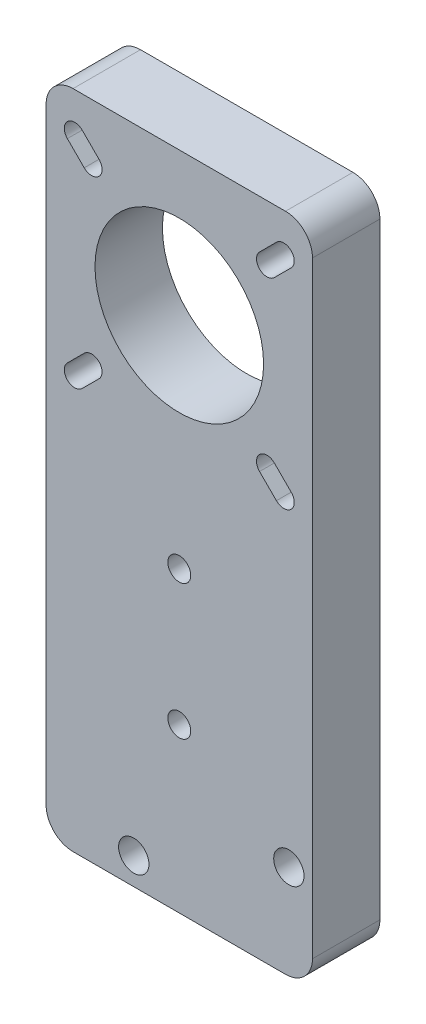
ISO-10303-21;
HEADER;
FILE_DESCRIPTION(('STEP AP214'),'2;1');
FILE_NAME('part.step','',(''),(''),'','','');
FILE_SCHEMA(('AUTOMOTIVE_DESIGN { 1 0 10303 214 1 1 1 1 }'));
ENDSEC;
DATA;
#1=APPLICATION_CONTEXT('core data for automotive mechanical design processes');
#2=APPLICATION_PROTOCOL_DEFINITION('international standard','automotive_design',2000,#1);
#3=PRODUCT_CONTEXT('',#1,'mechanical');
#4=PRODUCT('Part','Part','',(#3));
#5=PRODUCT_RELATED_PRODUCT_CATEGORY('part','',(#4));
#6=PRODUCT_DEFINITION_FORMATION('','',#4);
#7=PRODUCT_DEFINITION_CONTEXT('part definition',#1,'design');
#8=PRODUCT_DEFINITION('design','',#6,#7);
#9=PRODUCT_DEFINITION_SHAPE('','',#8);
#10=(LENGTH_UNIT() NAMED_UNIT(*) SI_UNIT(.MILLI.,.METRE.));
#11=(NAMED_UNIT(*) PLANE_ANGLE_UNIT() SI_UNIT($,.RADIAN.));
#12=(NAMED_UNIT(*) SI_UNIT($,.STERADIAN.) SOLID_ANGLE_UNIT());
#13=UNCERTAINTY_MEASURE_WITH_UNIT(LENGTH_MEASURE(1.E-05),#10,'distance_accuracy_value','');
#14=(GEOMETRIC_REPRESENTATION_CONTEXT(3) GLOBAL_UNCERTAINTY_ASSIGNED_CONTEXT((#13)) GLOBAL_UNIT_ASSIGNED_CONTEXT((#10,
#11,#12)) REPRESENTATION_CONTEXT('',''));
#15=CARTESIAN_POINT('',(0.,0.,0.));
#16=DIRECTION('',(0.,0.,1.));
#17=DIRECTION('',(1.,0.,0.));
#18=AXIS2_PLACEMENT_3D('',#15,#16,#17);
#19=CARTESIAN_POINT('',(0.,0.,10.));
#20=DIRECTION('',(0.,0.,1.));
#21=DIRECTION('',(1.,0.,0.));
#22=AXIS2_PLACEMENT_3D('',#19,#20,#21);
#23=PLANE('',#22);
#24=CARTESIAN_POINT('',(16.2499999999952,-34.9999999999994,10.));
#25=DIRECTION('',(0.,0.,-1.));
#26=DIRECTION('',(-1.,0.,0.));
#27=AXIS2_PLACEMENT_3D('',#24,#25,#26);
#28=CIRCLE('',#27,2.25);
#29=CARTESIAN_POINT('',(13.9999999999952,-34.9999999999994,10.));
#30=VERTEX_POINT('',#29);
#31=EDGE_CURVE('E687',#30,#30,#28,.T.);
#32=ORIENTED_EDGE('',*,*,#31,.T.);
#33=EDGE_LOOP('',(#32));
#34=FACE_BOUND('',#33,.T.);
#35=DIRECTION('',(0.707106781186538,-0.707106781186557,0.));
#36=VECTOR('',#35,1.);
#37=CARTESIAN_POINT('',(14.9710155108394,14.9710155108389,10.));
#38=LINE('',#37,#36);
#39=CARTESIAN_POINT('',(14.0960155108391,15.8460155108392,10.));
#40=VERTEX_POINT('',#39);
#41=CARTESIAN_POINT('',(16.596015510839,13.3460155108392,10.));
#42=VERTEX_POINT('',#41);
#43=EDGE_CURVE('E207',#40,#42,#38,.T.);
#44=ORIENTED_EDGE('',*,*,#43,.T.);
#45=CARTESIAN_POINT('',(15.4999999999999,12.2500000000001,10.));
#46=DIRECTION('',(0.,0.,1.));
#47=DIRECTION('',(1.,0.,0.));
#48=AXIS2_PLACEMENT_3D('',#45,#46,#47);
#49=CIRCLE('',#48,1.55);
#50=CARTESIAN_POINT('',(14.4039844891607,11.1539844891609,10.));
#51=VERTEX_POINT('',#50);
#52=EDGE_CURVE('E201',#42,#51,#49,.F.);
#53=ORIENTED_EDGE('',*,*,#52,.T.);
#54=DIRECTION('',(0.707106781186549,-0.707106781186546,0.));
#55=VECTOR('',#54,1.);
#56=CARTESIAN_POINT('',(12.7789844891608,12.7789844891608,10.));
#57=LINE('',#56,#55);
#58=CARTESIAN_POINT('',(11.9039844891608,13.6539844891609,10.));
#59=VERTEX_POINT('',#58);
#60=EDGE_CURVE('E205',#59,#51,#57,.T.);
#61=ORIENTED_EDGE('',*,*,#60,.F.);
#62=CARTESIAN_POINT('',(12.9999999999999,14.7500000000001,10.));
#63=DIRECTION('',(0.,0.,1.));
#64=DIRECTION('',(1.,0.,0.));
#65=AXIS2_PLACEMENT_3D('',#62,#63,#64);
#66=CIRCLE('',#65,1.55000000000003);
#67=EDGE_CURVE('E53',#59,#40,#66,.F.);
#68=ORIENTED_EDGE('',*,*,#67,.T.);
#69=EDGE_LOOP('',(#44,#53,#61,#68));
#70=FACE_BOUND('',#69,.T.);
#71=DIRECTION('',(-0.707106781186533,0.707106781186562,0.));
#72=VECTOR('',#71,1.);
#73=CARTESIAN_POINT('',(12.7789844891606,12.77898448916,10.));
#74=LINE('',#73,#72);
#75=CARTESIAN_POINT('',(-14.0960155108391,39.6539844891608,10.));
#76=VERTEX_POINT('',#75);
#77=CARTESIAN_POINT('',(-16.596015510839,42.1539844891608,10.));
#78=VERTEX_POINT('',#77);
#79=EDGE_CURVE('E398',#76,#78,#74,.T.);
#80=ORIENTED_EDGE('',*,*,#79,.T.);
#81=CARTESIAN_POINT('',(-15.4999999999999,43.25,10.));
#82=DIRECTION('',(0.,0.,1.));
#83=DIRECTION('',(1.,0.,0.));
#84=AXIS2_PLACEMENT_3D('',#81,#82,#83);
#85=CIRCLE('',#84,1.54999999999999);
#86=CARTESIAN_POINT('',(-14.4039844891608,44.3460155108391,10.));
#87=VERTEX_POINT('',#86);
#88=EDGE_CURVE('E401',#78,#87,#85,.F.);
#89=ORIENTED_EDGE('',*,*,#88,.T.);
#90=DIRECTION('',(-0.70710678118655,0.707106781186545,0.));
#91=VECTOR('',#90,1.);
#92=CARTESIAN_POINT('',(14.9710155108392,14.9710155108393,10.));
#93=LINE('',#92,#91);
#94=CARTESIAN_POINT('',(-11.9039844891607,41.8460155108391,10.));
#95=VERTEX_POINT('',#94);
#96=EDGE_CURVE('E403',#95,#87,#93,.T.);
#97=ORIENTED_EDGE('',*,*,#96,.F.);
#98=CARTESIAN_POINT('',(-12.9999999999999,40.75,10.));
#99=DIRECTION('',(0.,0.,1.));
#100=DIRECTION('',(1.,0.,0.));
#101=AXIS2_PLACEMENT_3D('',#98,#99,#100);
#102=CIRCLE('',#101,1.55000000000003);
#103=EDGE_CURVE('E406',#95,#76,#102,.F.);
#104=ORIENTED_EDGE('',*,*,#103,.T.);
#105=EDGE_LOOP('',(#80,#89,#97,#104));
#106=FACE_BOUND('',#105,.T.);
#107=DIRECTION('',(-1.,0.,0.));
#108=VECTOR('',#107,1.);
#109=CARTESIAN_POINT('',(0.,49.,10.));
#110=LINE('',#109,#108);
#111=CARTESIAN_POINT('',(15.75,49.,10.));
#112=VERTEX_POINT('',#111);
#113=CARTESIAN_POINT('',(-15.75,49.,10.));
#114=VERTEX_POINT('',#113);
#115=EDGE_CURVE('E378',#112,#114,#110,.T.);
#116=ORIENTED_EDGE('',*,*,#115,.T.);
#117=CARTESIAN_POINT('',(-15.75,45.,10.));
#118=DIRECTION('',(0.,0.,1.));
#119=DIRECTION('',(1.,0.,0.));
#120=AXIS2_PLACEMENT_3D('',#117,#118,#119);
#121=CIRCLE('',#120,4.00000000000001);
#122=CARTESIAN_POINT('',(-19.75,45.,10.));
#123=VERTEX_POINT('',#122);
#124=EDGE_CURVE('E381',#114,#123,#121,.T.);
#125=ORIENTED_EDGE('',*,*,#124,.T.);
#126=DIRECTION('',(0.,1.,0.));
#127=VECTOR('',#126,1.);
#128=CARTESIAN_POINT('',(-19.75,0.,10.));
#129=LINE('',#128,#127);
#130=CARTESIAN_POINT('',(-19.75,-45.,10.));
#131=VERTEX_POINT('',#130);
#132=EDGE_CURVE('E383',#131,#123,#129,.T.);
#133=ORIENTED_EDGE('',*,*,#132,.F.);
#134=CARTESIAN_POINT('',(-15.75,-45.,10.));
#135=DIRECTION('',(0.,0.,1.));
#136=DIRECTION('',(1.,0.,0.));
#137=AXIS2_PLACEMENT_3D('',#134,#135,#136);
#138=CIRCLE('',#137,4.00000000000001);
#139=CARTESIAN_POINT('',(-15.75,-49.,10.));
#140=VERTEX_POINT('',#139);
#141=EDGE_CURVE('E386',#140,#131,#138,.F.);
#142=ORIENTED_EDGE('',*,*,#141,.F.);
#143=DIRECTION('',(-1.,0.,0.));
#144=VECTOR('',#143,1.);
#145=CARTESIAN_POINT('',(0.,-49.,10.));
#146=LINE('',#145,#144);
#147=CARTESIAN_POINT('',(15.75,-49.,10.));
#148=VERTEX_POINT('',#147);
#149=EDGE_CURVE('E389',#148,#140,#146,.T.);
#150=ORIENTED_EDGE('',*,*,#149,.F.);
#151=CARTESIAN_POINT('',(15.75,-45.,10.));
#152=DIRECTION('',(0.,0.,1.));
#153=DIRECTION('',(1.,0.,0.));
#154=AXIS2_PLACEMENT_3D('',#151,#152,#153);
#155=CIRCLE('',#154,4.00000000000002);
#156=CARTESIAN_POINT('',(19.75,-45.,10.));
#157=VERTEX_POINT('',#156);
#158=EDGE_CURVE('E392',#148,#157,#155,.T.);
#159=ORIENTED_EDGE('',*,*,#158,.T.);
#160=DIRECTION('',(0.,1.,0.));
#161=VECTOR('',#160,1.);
#162=CARTESIAN_POINT('',(19.75,0.,10.));
#163=LINE('',#162,#161);
#164=CARTESIAN_POINT('',(19.75,45.,10.));
#165=VERTEX_POINT('',#164);
#166=EDGE_CURVE('E394',#157,#165,#163,.T.);
#167=ORIENTED_EDGE('',*,*,#166,.T.);
#168=CARTESIAN_POINT('',(15.75,45.,10.));
#169=DIRECTION('',(0.,0.,1.));
#170=DIRECTION('',(1.,0.,0.));
#171=AXIS2_PLACEMENT_3D('',#168,#169,#170);
#172=CIRCLE('',#171,4.00000000000001);
#173=EDGE_CURVE('E396',#165,#112,#172,.T.);
#174=ORIENTED_EDGE('',*,*,#173,.T.);
#175=EDGE_LOOP('',(#116,#125,#133,#142,#150,#159,#167,#174));
#176=FACE_BOUND('',#175,.T.);
#177=CARTESIAN_POINT('',(0.,27.75,10.));
#178=DIRECTION('',(0.,0.,1.));
#179=DIRECTION('',(1.,0.,0.));
#180=AXIS2_PLACEMENT_3D('',#177,#178,#179);
#181=CIRCLE('',#180,12.5);
#182=CARTESIAN_POINT('',(12.5,27.75,10.));
#183=VERTEX_POINT('',#182);
#184=EDGE_CURVE('E375',#183,#183,#181,.T.);
#185=ORIENTED_EDGE('',*,*,#184,.F.);
#186=EDGE_LOOP('',(#185));
#187=FACE_BOUND('',#186,.T.);
#188=CARTESIAN_POINT('',(15.4999999999999,43.25,10.));
#189=DIRECTION('',(0.,0.,1.));
#190=DIRECTION('',(1.,0.,0.));
#191=AXIS2_PLACEMENT_3D('',#188,#189,#190);
#192=CIRCLE('',#191,1.55);
#193=CARTESIAN_POINT('',(16.596015510839,42.1539844891608,10.));
#194=VERTEX_POINT('',#193);
#195=CARTESIAN_POINT('',(14.4039844891607,44.3460155108391,10.));
#196=VERTEX_POINT('',#195);
#197=EDGE_CURVE('E358',#194,#196,#192,.T.);
#198=ORIENTED_EDGE('',*,*,#197,.F.);
#199=DIRECTION('',(0.707106781186532,0.707106781186563,0.));
#200=VECTOR('',#199,1.);
#201=CARTESIAN_POINT('',(-12.7789844891605,12.77898448916,10.));
#202=LINE('',#201,#200);
#203=CARTESIAN_POINT('',(14.0960155108391,39.6539844891608,10.));
#204=VERTEX_POINT('',#203);
#205=EDGE_CURVE('E367',#204,#194,#202,.T.);
#206=ORIENTED_EDGE('',*,*,#205,.F.);
#207=CARTESIAN_POINT('',(12.9999999999999,40.75,10.));
#208=DIRECTION('',(0.,0.,1.));
#209=DIRECTION('',(1.,0.,0.));
#210=AXIS2_PLACEMENT_3D('',#207,#208,#209);
#211=CIRCLE('',#210,1.55000000000003);
#212=CARTESIAN_POINT('',(11.9039844891607,41.8460155108391,10.));
#213=VERTEX_POINT('',#212);
#214=EDGE_CURVE('E370',#213,#204,#211,.T.);
#215=ORIENTED_EDGE('',*,*,#214,.F.);
#216=DIRECTION('',(0.707106781186544,0.707106781186551,0.));
#217=VECTOR('',#216,1.);
#218=CARTESIAN_POINT('',(-14.9710155108391,14.971015510839,10.));
#219=LINE('',#218,#217);
#220=EDGE_CURVE('E373',#213,#196,#219,.T.);
#221=ORIENTED_EDGE('',*,*,#220,.T.);
#222=EDGE_LOOP('',(#198,#206,#215,#221));
#223=FACE_BOUND('',#222,.T.);
#224=CARTESIAN_POINT('',(-15.4999999999999,12.2500000000001,10.));
#225=DIRECTION('',(0.,0.,1.));
#226=DIRECTION('',(1.,0.,0.));
#227=AXIS2_PLACEMENT_3D('',#224,#225,#226);
#228=CIRCLE('',#227,1.54999999999998);
#229=CARTESIAN_POINT('',(-16.596015510839,13.3460155108392,10.));
#230=VERTEX_POINT('',#229);
#231=CARTESIAN_POINT('',(-14.4039844891608,11.1539844891609,10.));
#232=VERTEX_POINT('',#231);
#233=EDGE_CURVE('E291',#230,#232,#228,.T.);
#234=ORIENTED_EDGE('',*,*,#233,.F.);
#235=DIRECTION('',(-0.707106781186538,-0.707106781186557,0.));
#236=VECTOR('',#235,1.);
#237=CARTESIAN_POINT('',(-14.9710155108393,14.9710155108389,10.));
#238=LINE('',#237,#236);
#239=CARTESIAN_POINT('',(-14.0960155108391,15.8460155108392,10.));
#240=VERTEX_POINT('',#239);
#241=EDGE_CURVE('E344',#240,#230,#238,.T.);
#242=ORIENTED_EDGE('',*,*,#241,.F.);
#243=CARTESIAN_POINT('',(-12.9999999999999,14.7500000000001,10.));
#244=DIRECTION('',(0.,0.,1.));
#245=DIRECTION('',(1.,0.,0.));
#246=AXIS2_PLACEMENT_3D('',#243,#244,#245);
#247=CIRCLE('',#246,1.55000000000003);
#248=CARTESIAN_POINT('',(-11.9039844891608,13.6539844891609,10.));
#249=VERTEX_POINT('',#248);
#250=EDGE_CURVE('E353',#249,#240,#247,.T.);
#251=ORIENTED_EDGE('',*,*,#250,.F.);
#252=DIRECTION('',(-0.707106781186555,-0.70710678118654,0.));
#253=VECTOR('',#252,1.);
#254=CARTESIAN_POINT('',(-12.7789844891607,12.778984489161,10.));
#255=LINE('',#254,#253);
#256=EDGE_CURVE('E355',#249,#232,#255,.T.);
#257=ORIENTED_EDGE('',*,*,#256,.T.);
#258=EDGE_LOOP('',(#234,#242,#251,#257));
#259=FACE_BOUND('',#258,.T.);
#260=CARTESIAN_POINT('',(0.,-24.8,10.));
#261=DIRECTION('',(0.,0.,-1.));
#262=DIRECTION('',(-1.,0.,0.));
#263=AXIS2_PLACEMENT_3D('',#260,#261,#262);
#264=CIRCLE('',#263,1.7);
#265=CARTESIAN_POINT('',(-1.7,-24.8,10.));
#266=VERTEX_POINT('',#265);
#267=EDGE_CURVE('E228',#266,#266,#264,.T.);
#268=ORIENTED_EDGE('',*,*,#267,.T.);
#269=EDGE_LOOP('',(#268));
#270=FACE_BOUND('',#269,.T.);
#271=CARTESIAN_POINT('',(0.,-4.80000000000001,10.));
#272=DIRECTION('',(0.,0.,-1.));
#273=DIRECTION('',(-1.,0.,0.));
#274=AXIS2_PLACEMENT_3D('',#271,#272,#273);
#275=CIRCLE('',#274,1.7);
#276=CARTESIAN_POINT('',(-1.7,-4.80000000000001,10.));
#277=VERTEX_POINT('',#276);
#278=EDGE_CURVE('E438',#277,#277,#275,.T.);
#279=ORIENTED_EDGE('',*,*,#278,.T.);
#280=EDGE_LOOP('',(#279));
#281=FACE_BOUND('',#280,.T.);
#282=CARTESIAN_POINT('',(-6.75000000000467,-44.9999999999996,10.));
#283=DIRECTION('',(0.,0.,-1.));
#284=DIRECTION('',(-1.,0.,0.));
#285=AXIS2_PLACEMENT_3D('',#282,#283,#284);
#286=CIRCLE('',#285,2.25);
#287=CARTESIAN_POINT('',(-9.00000000000467,-44.9999999999996,10.));
#288=VERTEX_POINT('',#287);
#289=EDGE_CURVE('E679',#288,#288,#286,.T.);
#290=ORIENTED_EDGE('',*,*,#289,.T.);
#291=EDGE_LOOP('',(#290));
#292=FACE_BOUND('',#291,.T.);
#293=ADVANCED_FACE('F34',(#34,#70,#106,#176,#187,#223,#259,#270,#281,#292),#23,.T.);
#294=CARTESIAN_POINT('',(0.,0.,0.));
#295=DIRECTION('',(0.,0.,1.));
#296=DIRECTION('',(1.,0.,0.));
#297=AXIS2_PLACEMENT_3D('',#294,#295,#296);
#298=PLANE('',#297);
#299=CARTESIAN_POINT('',(16.2499999999952,-34.9999999999994,0.));
#300=DIRECTION('',(0.,0.,-1.));
#301=DIRECTION('',(-1.,0.,0.));
#302=AXIS2_PLACEMENT_3D('',#299,#300,#301);
#303=CIRCLE('',#302,2.24999999999999);
#304=CARTESIAN_POINT('',(13.9999999999952,-34.9999999999994,0.));
#305=VERTEX_POINT('',#304);
#306=EDGE_CURVE('E689',#305,#305,#303,.T.);
#307=ORIENTED_EDGE('',*,*,#306,.F.);
#308=EDGE_LOOP('',(#307));
#309=FACE_BOUND('',#308,.T.);
#310=CARTESIAN_POINT('',(-6.75000000000467,-44.9999999999996,0.));
#311=DIRECTION('',(0.,0.,-1.));
#312=DIRECTION('',(-1.,0.,0.));
#313=AXIS2_PLACEMENT_3D('',#310,#311,#312);
#314=CIRCLE('',#313,2.24999999999999);
#315=CARTESIAN_POINT('',(-9.00000000000466,-44.9999999999996,0.));
#316=VERTEX_POINT('',#315);
#317=EDGE_CURVE('E684',#316,#316,#314,.T.);
#318=ORIENTED_EDGE('',*,*,#317,.F.);
#319=EDGE_LOOP('',(#318));
#320=FACE_BOUND('',#319,.T.);
#321=CARTESIAN_POINT('',(0.,-4.80000000000001,0.));
#322=DIRECTION('',(0.,0.,-1.));
#323=DIRECTION('',(-1.,0.,0.));
#324=AXIS2_PLACEMENT_3D('',#321,#322,#323);
#325=CIRCLE('',#324,3.5);
#326=CARTESIAN_POINT('',(-3.5,-4.80000000000001,0.));
#327=VERTEX_POINT('',#326);
#328=EDGE_CURVE('E676',#327,#327,#325,.T.);
#329=ORIENTED_EDGE('',*,*,#328,.F.);
#330=EDGE_LOOP('',(#329));
#331=FACE_BOUND('',#330,.T.);
#332=CARTESIAN_POINT('',(-15.4999999999999,12.2500000000001,0.));
#333=DIRECTION('',(0.,0.,1.));
#334=DIRECTION('',(1.,0.,0.));
#335=AXIS2_PLACEMENT_3D('',#332,#333,#334);
#336=CIRCLE('',#335,1.54999999999998);
#337=CARTESIAN_POINT('',(-16.596015510839,13.3460155108392,0.));
#338=VERTEX_POINT('',#337);
#339=CARTESIAN_POINT('',(-14.4039844891608,11.1539844891609,0.));
#340=VERTEX_POINT('',#339);
#341=EDGE_CURVE('E224',#338,#340,#336,.T.);
#342=ORIENTED_EDGE('',*,*,#341,.T.);
#343=DIRECTION('',(-0.707106781186555,-0.70710678118654,0.));
#344=VECTOR('',#343,1.);
#345=CARTESIAN_POINT('',(-12.7789844891607,12.778984489161,0.));
#346=LINE('',#345,#344);
#347=CARTESIAN_POINT('',(-11.9039844891608,13.6539844891609,0.));
#348=VERTEX_POINT('',#347);
#349=EDGE_CURVE('E234',#348,#340,#346,.T.);
#350=ORIENTED_EDGE('',*,*,#349,.F.);
#351=CARTESIAN_POINT('',(-12.9999999999999,14.7500000000001,0.));
#352=DIRECTION('',(0.,0.,1.));
#353=DIRECTION('',(1.,0.,0.));
#354=AXIS2_PLACEMENT_3D('',#351,#352,#353);
#355=CIRCLE('',#354,1.55000000000003);
#356=CARTESIAN_POINT('',(-14.0960155108391,15.8460155108392,0.));
#357=VERTEX_POINT('',#356);
#358=EDGE_CURVE('E231',#348,#357,#355,.T.);
#359=ORIENTED_EDGE('',*,*,#358,.T.);
#360=DIRECTION('',(-0.707106781186538,-0.707106781186557,0.));
#361=VECTOR('',#360,1.);
#362=CARTESIAN_POINT('',(-14.9710155108393,14.9710155108389,0.));
#363=LINE('',#362,#361);
#364=EDGE_CURVE('E227',#357,#338,#363,.T.);
#365=ORIENTED_EDGE('',*,*,#364,.T.);
#366=EDGE_LOOP('',(#342,#350,#359,#365));
#367=FACE_BOUND('',#366,.T.);
#368=CARTESIAN_POINT('',(15.4999999999999,43.25,0.));
#369=DIRECTION('',(0.,0.,1.));
#370=DIRECTION('',(1.,0.,0.));
#371=AXIS2_PLACEMENT_3D('',#368,#369,#370);
#372=CIRCLE('',#371,1.55);
#373=CARTESIAN_POINT('',(16.596015510839,42.1539844891608,0.));
#374=VERTEX_POINT('',#373);
#375=CARTESIAN_POINT('',(14.4039844891607,44.3460155108391,0.));
#376=VERTEX_POINT('',#375);
#377=EDGE_CURVE('E237',#374,#376,#372,.T.);
#378=ORIENTED_EDGE('',*,*,#377,.T.);
#379=DIRECTION('',(0.707106781186544,0.707106781186551,0.));
#380=VECTOR('',#379,1.);
#381=CARTESIAN_POINT('',(-14.9710155108391,14.971015510839,0.));
#382=LINE('',#381,#380);
#383=CARTESIAN_POINT('',(11.9039844891607,41.8460155108391,0.));
#384=VERTEX_POINT('',#383);
#385=EDGE_CURVE('E246',#384,#376,#382,.T.);
#386=ORIENTED_EDGE('',*,*,#385,.F.);
#387=CARTESIAN_POINT('',(12.9999999999999,40.75,0.));
#388=DIRECTION('',(0.,0.,1.));
#389=DIRECTION('',(1.,0.,0.));
#390=AXIS2_PLACEMENT_3D('',#387,#388,#389);
#391=CIRCLE('',#390,1.55000000000003);
#392=CARTESIAN_POINT('',(14.0960155108391,39.6539844891608,0.));
#393=VERTEX_POINT('',#392);
#394=EDGE_CURVE('E243',#384,#393,#391,.T.);
#395=ORIENTED_EDGE('',*,*,#394,.T.);
#396=DIRECTION('',(0.707106781186532,0.707106781186563,0.));
#397=VECTOR('',#396,1.);
#398=CARTESIAN_POINT('',(-12.7789844891605,12.77898448916,0.));
#399=LINE('',#398,#397);
#400=EDGE_CURVE('E240',#393,#374,#399,.T.);
#401=ORIENTED_EDGE('',*,*,#400,.T.);
#402=EDGE_LOOP('',(#378,#386,#395,#401));
#403=FACE_BOUND('',#402,.T.);
#404=CARTESIAN_POINT('',(0.,27.75,0.));
#405=DIRECTION('',(0.,0.,1.));
#406=DIRECTION('',(1.,0.,0.));
#407=AXIS2_PLACEMENT_3D('',#404,#405,#406);
#408=CIRCLE('',#407,12.5);
#409=CARTESIAN_POINT('',(12.5,27.75,0.));
#410=VERTEX_POINT('',#409);
#411=EDGE_CURVE('E249',#410,#410,#408,.T.);
#412=ORIENTED_EDGE('',*,*,#411,.T.);
#413=EDGE_LOOP('',(#412));
#414=FACE_BOUND('',#413,.T.);
#415=DIRECTION('',(-1.,0.,0.));
#416=VECTOR('',#415,1.);
#417=CARTESIAN_POINT('',(0.,49.,0.));
#418=LINE('',#417,#416);
#419=CARTESIAN_POINT('',(15.75,49.,0.));
#420=VERTEX_POINT('',#419);
#421=CARTESIAN_POINT('',(-15.75,49.,0.));
#422=VERTEX_POINT('',#421);
#423=EDGE_CURVE('E252',#420,#422,#418,.T.);
#424=ORIENTED_EDGE('',*,*,#423,.F.);
#425=CARTESIAN_POINT('',(15.75,45.,0.));
#426=DIRECTION('',(0.,0.,1.));
#427=DIRECTION('',(1.,0.,0.));
#428=AXIS2_PLACEMENT_3D('',#425,#426,#427);
#429=CIRCLE('',#428,4.00000000000001);
#430=CARTESIAN_POINT('',(19.75,45.,0.));
#431=VERTEX_POINT('',#430);
#432=EDGE_CURVE('E271',#431,#420,#429,.T.);
#433=ORIENTED_EDGE('',*,*,#432,.F.);
#434=DIRECTION('',(0.,1.,0.));
#435=VECTOR('',#434,1.);
#436=CARTESIAN_POINT('',(19.75,0.,0.));
#437=LINE('',#436,#435);
#438=CARTESIAN_POINT('',(19.75,-45.,0.));
#439=VERTEX_POINT('',#438);
#440=EDGE_CURVE('E269',#439,#431,#437,.T.);
#441=ORIENTED_EDGE('',*,*,#440,.F.);
#442=CARTESIAN_POINT('',(15.75,-45.,0.));
#443=DIRECTION('',(0.,0.,1.));
#444=DIRECTION('',(1.,0.,0.));
#445=AXIS2_PLACEMENT_3D('',#442,#443,#444);
#446=CIRCLE('',#445,4.00000000000002);
#447=CARTESIAN_POINT('',(15.75,-49.,0.));
#448=VERTEX_POINT('',#447);
#449=EDGE_CURVE('E267',#448,#439,#446,.T.);
#450=ORIENTED_EDGE('',*,*,#449,.F.);
#451=DIRECTION('',(-1.,0.,0.));
#452=VECTOR('',#451,1.);
#453=CARTESIAN_POINT('',(0.,-49.,0.));
#454=LINE('',#453,#452);
#455=CARTESIAN_POINT('',(-15.75,-49.,0.));
#456=VERTEX_POINT('',#455);
#457=EDGE_CURVE('E264',#448,#456,#454,.T.);
#458=ORIENTED_EDGE('',*,*,#457,.T.);
#459=CARTESIAN_POINT('',(-15.75,-45.,0.));
#460=DIRECTION('',(0.,0.,1.));
#461=DIRECTION('',(1.,0.,0.));
#462=AXIS2_PLACEMENT_3D('',#459,#460,#461);
#463=CIRCLE('',#462,4.00000000000001);
#464=CARTESIAN_POINT('',(-19.75,-45.,0.));
#465=VERTEX_POINT('',#464);
#466=EDGE_CURVE('E261',#456,#465,#463,.F.);
#467=ORIENTED_EDGE('',*,*,#466,.T.);
#468=DIRECTION('',(0.,1.,0.));
#469=VECTOR('',#468,1.);
#470=CARTESIAN_POINT('',(-19.75,0.,0.));
#471=LINE('',#470,#469);
#472=CARTESIAN_POINT('',(-19.75,45.,0.));
#473=VERTEX_POINT('',#472);
#474=EDGE_CURVE('E258',#465,#473,#471,.T.);
#475=ORIENTED_EDGE('',*,*,#474,.T.);
#476=CARTESIAN_POINT('',(-15.75,45.,0.));
#477=DIRECTION('',(0.,0.,1.));
#478=DIRECTION('',(1.,0.,0.));
#479=AXIS2_PLACEMENT_3D('',#476,#477,#478);
#480=CIRCLE('',#479,4.00000000000001);
#481=EDGE_CURVE('E255',#422,#473,#480,.T.);
#482=ORIENTED_EDGE('',*,*,#481,.F.);
#483=EDGE_LOOP('',(#424,#433,#441,#450,#458,#467,#475,#482));
#484=FACE_BOUND('',#483,.T.);
#485=DIRECTION('',(-0.707106781186533,0.707106781186562,0.));
#486=VECTOR('',#485,1.);
#487=CARTESIAN_POINT('',(12.7789844891606,12.77898448916,0.));
#488=LINE('',#487,#486);
#489=CARTESIAN_POINT('',(-14.0960155108391,39.6539844891608,0.));
#490=VERTEX_POINT('',#489);
#491=CARTESIAN_POINT('',(-16.596015510839,42.1539844891608,0.));
#492=VERTEX_POINT('',#491);
#493=EDGE_CURVE('E273',#490,#492,#488,.T.);
#494=ORIENTED_EDGE('',*,*,#493,.F.);
#495=CARTESIAN_POINT('',(-12.9999999999999,40.75,0.));
#496=DIRECTION('',(0.,0.,1.));
#497=DIRECTION('',(1.,0.,0.));
#498=AXIS2_PLACEMENT_3D('',#495,#496,#497);
#499=CIRCLE('',#498,1.55000000000003);
#500=CARTESIAN_POINT('',(-11.9039844891607,41.8460155108391,0.));
#501=VERTEX_POINT('',#500);
#502=EDGE_CURVE('E282',#501,#490,#499,.F.);
#503=ORIENTED_EDGE('',*,*,#502,.F.);
#504=DIRECTION('',(-0.70710678118655,0.707106781186545,0.));
#505=VECTOR('',#504,1.);
#506=CARTESIAN_POINT('',(14.9710155108392,14.9710155108393,0.));
#507=LINE('',#506,#505);
#508=CARTESIAN_POINT('',(-14.4039844891608,44.3460155108391,0.));
#509=VERTEX_POINT('',#508);
#510=EDGE_CURVE('E279',#501,#509,#507,.T.);
#511=ORIENTED_EDGE('',*,*,#510,.T.);
#512=CARTESIAN_POINT('',(-15.4999999999999,43.25,0.));
#513=DIRECTION('',(0.,0.,1.));
#514=DIRECTION('',(1.,0.,0.));
#515=AXIS2_PLACEMENT_3D('',#512,#513,#514);
#516=CIRCLE('',#515,1.54999999999999);
#517=EDGE_CURVE('E276',#492,#509,#516,.F.);
#518=ORIENTED_EDGE('',*,*,#517,.F.);
#519=EDGE_LOOP('',(#494,#503,#511,#518));
#520=FACE_BOUND('',#519,.T.);
#521=DIRECTION('',(0.707106781186538,-0.707106781186557,0.));
#522=VECTOR('',#521,1.);
#523=CARTESIAN_POINT('',(14.9710155108394,14.9710155108389,0.));
#524=LINE('',#523,#522);
#525=CARTESIAN_POINT('',(14.0960155108391,15.8460155108392,0.));
#526=VERTEX_POINT('',#525);
#527=CARTESIAN_POINT('',(16.596015510839,13.3460155108392,0.));
#528=VERTEX_POINT('',#527);
#529=EDGE_CURVE('E284',#526,#528,#524,.T.);
#530=ORIENTED_EDGE('',*,*,#529,.F.);
#531=CARTESIAN_POINT('',(12.9999999999999,14.7500000000001,0.));
#532=DIRECTION('',(0.,0.,1.));
#533=DIRECTION('',(1.,0.,0.));
#534=AXIS2_PLACEMENT_3D('',#531,#532,#533);
#535=CIRCLE('',#534,1.55000000000003);
#536=CARTESIAN_POINT('',(11.9039844891608,13.6539844891609,0.));
#537=VERTEX_POINT('',#536);
#538=EDGE_CURVE('E132',#537,#526,#535,.F.);
#539=ORIENTED_EDGE('',*,*,#538,.F.);
#540=DIRECTION('',(0.707106781186549,-0.707106781186546,0.));
#541=VECTOR('',#540,1.);
#542=CARTESIAN_POINT('',(12.7789844891608,12.7789844891608,0.));
#543=LINE('',#542,#541);
#544=CARTESIAN_POINT('',(14.4039844891607,11.1539844891609,0.));
#545=VERTEX_POINT('',#544);
#546=EDGE_CURVE('E288',#537,#545,#543,.T.);
#547=ORIENTED_EDGE('',*,*,#546,.T.);
#548=CARTESIAN_POINT('',(15.4999999999999,12.2500000000001,0.));
#549=DIRECTION('',(0.,0.,1.));
#550=DIRECTION('',(1.,0.,0.));
#551=AXIS2_PLACEMENT_3D('',#548,#549,#550);
#552=CIRCLE('',#551,1.55);
#553=EDGE_CURVE('E213',#528,#545,#552,.F.);
#554=ORIENTED_EDGE('',*,*,#553,.F.);
#555=EDGE_LOOP('',(#530,#539,#547,#554));
#556=FACE_BOUND('',#555,.T.);
#557=CARTESIAN_POINT('',(0.,-24.8,0.));
#558=DIRECTION('',(0.,0.,-1.));
#559=DIRECTION('',(-1.,0.,0.));
#560=AXIS2_PLACEMENT_3D('',#557,#558,#559);
#561=CIRCLE('',#560,3.5);
#562=CARTESIAN_POINT('',(-3.5,-24.8,0.));
#563=VERTEX_POINT('',#562);
#564=EDGE_CURVE('E435',#563,#563,#561,.T.);
#565=ORIENTED_EDGE('',*,*,#564,.F.);
#566=EDGE_LOOP('',(#565));
#567=FACE_BOUND('',#566,.T.);
#568=ADVANCED_FACE('F348',(#309,#320,#331,#367,#403,#414,#484,#520,#556,#567),#298,.F.);
#569=CARTESIAN_POINT('',(14.9710155108394,14.9710155108389,10.));
#570=DIRECTION('',(0.707106781186557,0.707106781186538,0.));
#571=DIRECTION('',(-0.707106781186538,0.707106781186557,0.));
#572=AXIS2_PLACEMENT_3D('',#569,#570,#571);
#573=PLANE('',#572);
#574=ORIENTED_EDGE('',*,*,#529,.T.);
#575=DIRECTION('',(0.,0.,-1.));
#576=VECTOR('',#575,1.);
#577=CARTESIAN_POINT('',(16.596015510839,13.3460155108392,10.));
#578=LINE('',#577,#576);
#579=EDGE_CURVE('E11',#42,#528,#578,.T.);
#580=ORIENTED_EDGE('',*,*,#579,.F.);
#581=ORIENTED_EDGE('',*,*,#43,.F.);
#582=DIRECTION('',(0.,0.,-1.));
#583=VECTOR('',#582,1.);
#584=CARTESIAN_POINT('',(14.0960155108391,15.8460155108392,10.));
#585=LINE('',#584,#583);
#586=EDGE_CURVE('E292',#40,#526,#585,.T.);
#587=ORIENTED_EDGE('',*,*,#586,.T.);
#588=EDGE_LOOP('',(#574,#580,#581,#587));
#589=FACE_BOUND('',#588,.T.);
#590=ADVANCED_FACE('F428',(#589),#573,.F.);
#591=CARTESIAN_POINT('',(15.4999999999999,12.2500000000001,10.));
#592=DIRECTION('',(0.,0.,-1.));
#593=DIRECTION('',(-1.,0.,0.));
#594=AXIS2_PLACEMENT_3D('',#591,#592,#593);
#595=CYLINDRICAL_SURFACE('',#594,1.55);
#596=ORIENTED_EDGE('',*,*,#553,.T.);
#597=DIRECTION('',(0.,0.,-1.));
#598=VECTOR('',#597,1.);
#599=CARTESIAN_POINT('',(14.4039844891607,11.1539844891609,10.));
#600=LINE('',#599,#598);
#601=EDGE_CURVE('E44',#51,#545,#600,.T.);
#602=ORIENTED_EDGE('',*,*,#601,.F.);
#603=ORIENTED_EDGE('',*,*,#52,.F.);
#604=ORIENTED_EDGE('',*,*,#579,.T.);
#605=EDGE_LOOP('',(#596,#602,#603,#604));
#606=FACE_BOUND('',#605,.T.);
#607=ADVANCED_FACE('F212',(#606),#595,.F.);
#608=CARTESIAN_POINT('',(12.7789844891608,12.7789844891608,10.));
#609=DIRECTION('',(0.707106781186546,0.707106781186549,0.));
#610=DIRECTION('',(-0.707106781186549,0.707106781186546,0.));
#611=AXIS2_PLACEMENT_3D('',#608,#609,#610);
#612=PLANE('',#611);
#613=ORIENTED_EDGE('',*,*,#546,.F.);
#614=DIRECTION('',(0.,0.,-1.));
#615=VECTOR('',#614,1.);
#616=CARTESIAN_POINT('',(11.9039844891608,13.6539844891609,10.));
#617=LINE('',#616,#615);
#618=EDGE_CURVE('E129',#59,#537,#617,.T.);
#619=ORIENTED_EDGE('',*,*,#618,.F.);
#620=ORIENTED_EDGE('',*,*,#60,.T.);
#621=ORIENTED_EDGE('',*,*,#601,.T.);
#622=EDGE_LOOP('',(#613,#619,#620,#621));
#623=FACE_BOUND('',#622,.T.);
#624=ADVANCED_FACE('F218',(#623),#612,.T.);
#625=CARTESIAN_POINT('',(12.7789844891606,12.77898448916,10.));
#626=DIRECTION('',(-0.707106781186562,-0.707106781186533,0.));
#627=DIRECTION('',(0.707106781186533,-0.707106781186562,0.));
#628=AXIS2_PLACEMENT_3D('',#625,#626,#627);
#629=PLANE('',#628);
#630=ORIENTED_EDGE('',*,*,#493,.T.);
#631=DIRECTION('',(0.,0.,-1.));
#632=VECTOR('',#631,1.);
#633=CARTESIAN_POINT('',(-16.596015510839,42.1539844891608,10.));
#634=LINE('',#633,#632);
#635=EDGE_CURVE('E294',#78,#492,#634,.T.);
#636=ORIENTED_EDGE('',*,*,#635,.F.);
#637=ORIENTED_EDGE('',*,*,#79,.F.);
#638=DIRECTION('',(0.,0.,-1.));
#639=VECTOR('',#638,1.);
#640=CARTESIAN_POINT('',(-14.0960155108391,39.6539844891608,10.));
#641=LINE('',#640,#639);
#642=EDGE_CURVE('E296',#76,#490,#641,.T.);
#643=ORIENTED_EDGE('',*,*,#642,.T.);
#644=EDGE_LOOP('',(#630,#636,#637,#643));
#645=FACE_BOUND('',#644,.T.);
#646=ADVANCED_FACE('F418',(#645),#629,.F.);
#647=CARTESIAN_POINT('',(-15.4999999999999,43.25,10.));
#648=DIRECTION('',(0.,0.,-1.));
#649=DIRECTION('',(-1.,0.,0.));
#650=AXIS2_PLACEMENT_3D('',#647,#648,#649);
#651=CYLINDRICAL_SURFACE('',#650,1.54999999999999);
#652=ORIENTED_EDGE('',*,*,#517,.T.);
#653=DIRECTION('',(0.,0.,-1.));
#654=VECTOR('',#653,1.);
#655=CARTESIAN_POINT('',(-14.4039844891608,44.3460155108391,10.));
#656=LINE('',#655,#654);
#657=EDGE_CURVE('E302',#87,#509,#656,.T.);
#658=ORIENTED_EDGE('',*,*,#657,.F.);
#659=ORIENTED_EDGE('',*,*,#88,.F.);
#660=ORIENTED_EDGE('',*,*,#635,.T.);
#661=EDGE_LOOP('',(#652,#658,#659,#660));
#662=FACE_BOUND('',#661,.T.);
#663=ADVANCED_FACE('F420',(#662),#651,.F.);
#664=CARTESIAN_POINT('',(14.9710155108392,14.9710155108393,10.));
#665=DIRECTION('',(-0.707106781186545,-0.70710678118655,0.));
#666=DIRECTION('',(0.70710678118655,-0.707106781186545,0.));
#667=AXIS2_PLACEMENT_3D('',#664,#665,#666);
#668=PLANE('',#667);
#669=ORIENTED_EDGE('',*,*,#510,.F.);
#670=DIRECTION('',(0.,0.,-1.));
#671=VECTOR('',#670,1.);
#672=CARTESIAN_POINT('',(-11.9039844891607,41.8460155108391,10.));
#673=LINE('',#672,#671);
#674=EDGE_CURVE('E299',#95,#501,#673,.T.);
#675=ORIENTED_EDGE('',*,*,#674,.F.);
#676=ORIENTED_EDGE('',*,*,#96,.T.);
#677=ORIENTED_EDGE('',*,*,#657,.T.);
#678=EDGE_LOOP('',(#669,#675,#676,#677));
#679=FACE_BOUND('',#678,.T.);
#680=ADVANCED_FACE('F424',(#679),#668,.T.);
#681=CARTESIAN_POINT('',(0.,49.,10.));
#682=DIRECTION('',(0.,-1.,0.));
#683=DIRECTION('',(1.,0.,0.));
#684=AXIS2_PLACEMENT_3D('',#681,#682,#683);
#685=PLANE('',#684);
#686=ORIENTED_EDGE('',*,*,#423,.T.);
#687=DIRECTION('',(0.,0.,-1.));
#688=VECTOR('',#687,1.);
#689=CARTESIAN_POINT('',(-15.75,49.,10.));
#690=LINE('',#689,#688);
#691=EDGE_CURVE('E300',#114,#422,#690,.T.);
#692=ORIENTED_EDGE('',*,*,#691,.F.);
#693=ORIENTED_EDGE('',*,*,#115,.F.);
#694=DIRECTION('',(0.,0.,-1.));
#695=VECTOR('',#694,1.);
#696=CARTESIAN_POINT('',(15.75,49.,10.));
#697=LINE('',#696,#695);
#698=EDGE_CURVE('E306',#112,#420,#697,.T.);
#699=ORIENTED_EDGE('',*,*,#698,.T.);
#700=EDGE_LOOP('',(#686,#692,#693,#699));
#701=FACE_BOUND('',#700,.T.);
#702=ADVANCED_FACE('F498',(#701),#685,.F.);
#703=CARTESIAN_POINT('',(-15.75,45.,10.));
#704=DIRECTION('',(0.,0.,-1.));
#705=DIRECTION('',(-1.,0.,0.));
#706=AXIS2_PLACEMENT_3D('',#703,#704,#705);
#707=CYLINDRICAL_SURFACE('',#706,4.00000000000001);
#708=ORIENTED_EDGE('',*,*,#481,.T.);
#709=DIRECTION('',(0.,0.,-1.));
#710=VECTOR('',#709,1.);
#711=CARTESIAN_POINT('',(-19.75,45.,10.));
#712=LINE('',#711,#710);
#713=EDGE_CURVE('E322',#123,#473,#712,.T.);
#714=ORIENTED_EDGE('',*,*,#713,.F.);
#715=ORIENTED_EDGE('',*,*,#124,.F.);
#716=ORIENTED_EDGE('',*,*,#691,.T.);
#717=EDGE_LOOP('',(#708,#714,#715,#716));
#718=FACE_BOUND('',#717,.T.);
#719=ADVANCED_FACE('F527',(#718),#707,.T.);
#720=CARTESIAN_POINT('',(-19.75,0.,10.));
#721=DIRECTION('',(-1.,0.,0.));
#722=DIRECTION('',(0.,0.,1.));
#723=AXIS2_PLACEMENT_3D('',#720,#721,#722);
#724=PLANE('',#723);
#725=ORIENTED_EDGE('',*,*,#474,.F.);
#726=DIRECTION('',(0.,0.,-1.));
#727=VECTOR('',#726,1.);
#728=CARTESIAN_POINT('',(-19.75,-45.,10.));
#729=LINE('',#728,#727);
#730=EDGE_CURVE('E320',#131,#465,#729,.T.);
#731=ORIENTED_EDGE('',*,*,#730,.F.);
#732=ORIENTED_EDGE('',*,*,#132,.T.);
#733=ORIENTED_EDGE('',*,*,#713,.T.);
#734=EDGE_LOOP('',(#725,#731,#732,#733));
#735=FACE_BOUND('',#734,.T.);
#736=ADVANCED_FACE('F523',(#735),#724,.T.);
#737=CARTESIAN_POINT('',(-15.75,-45.,10.));
#738=DIRECTION('',(0.,0.,-1.));
#739=DIRECTION('',(-1.,0.,0.));
#740=AXIS2_PLACEMENT_3D('',#737,#738,#739);
#741=CYLINDRICAL_SURFACE('',#740,4.00000000000001);
#742=ORIENTED_EDGE('',*,*,#466,.F.);
#743=DIRECTION('',(0.,0.,-1.));
#744=VECTOR('',#743,1.);
#745=CARTESIAN_POINT('',(-15.75,-49.,10.));
#746=LINE('',#745,#744);
#747=EDGE_CURVE('E318',#140,#456,#746,.T.);
#748=ORIENTED_EDGE('',*,*,#747,.F.);
#749=ORIENTED_EDGE('',*,*,#141,.T.);
#750=ORIENTED_EDGE('',*,*,#730,.T.);
#751=EDGE_LOOP('',(#742,#748,#749,#750));
#752=FACE_BOUND('',#751,.T.);
#753=ADVANCED_FACE('F519',(#752),#741,.T.);
#754=CARTESIAN_POINT('',(0.,-49.,10.));
#755=DIRECTION('',(0.,-1.,0.));
#756=DIRECTION('',(1.,0.,0.));
#757=AXIS2_PLACEMENT_3D('',#754,#755,#756);
#758=PLANE('',#757);
#759=ORIENTED_EDGE('',*,*,#457,.F.);
#760=DIRECTION('',(0.,0.,-1.));
#761=VECTOR('',#760,1.);
#762=CARTESIAN_POINT('',(15.75,-49.,10.));
#763=LINE('',#762,#761);
#764=EDGE_CURVE('E316',#148,#448,#763,.T.);
#765=ORIENTED_EDGE('',*,*,#764,.F.);
#766=ORIENTED_EDGE('',*,*,#149,.T.);
#767=ORIENTED_EDGE('',*,*,#747,.T.);
#768=EDGE_LOOP('',(#759,#765,#766,#767));
#769=FACE_BOUND('',#768,.T.);
#770=ADVANCED_FACE('F515',(#769),#758,.T.);
#771=CARTESIAN_POINT('',(15.75,-45.,10.));
#772=DIRECTION('',(0.,0.,-1.));
#773=DIRECTION('',(-1.,0.,0.));
#774=AXIS2_PLACEMENT_3D('',#771,#772,#773);
#775=CYLINDRICAL_SURFACE('',#774,4.00000000000002);
#776=ORIENTED_EDGE('',*,*,#449,.T.);
#777=DIRECTION('',(0.,0.,-1.));
#778=VECTOR('',#777,1.);
#779=CARTESIAN_POINT('',(19.75,-45.,10.));
#780=LINE('',#779,#778);
#781=EDGE_CURVE('E313',#157,#439,#780,.T.);
#782=ORIENTED_EDGE('',*,*,#781,.F.);
#783=ORIENTED_EDGE('',*,*,#158,.F.);
#784=ORIENTED_EDGE('',*,*,#764,.T.);
#785=EDGE_LOOP('',(#776,#782,#783,#784));
#786=FACE_BOUND('',#785,.T.);
#787=ADVANCED_FACE('F511',(#786),#775,.T.);
#788=CARTESIAN_POINT('',(19.75,0.,10.));
#789=DIRECTION('',(-1.,0.,0.));
#790=DIRECTION('',(0.,-1.,0.));
#791=AXIS2_PLACEMENT_3D('',#788,#789,#790);
#792=PLANE('',#791);
#793=ORIENTED_EDGE('',*,*,#440,.T.);
#794=DIRECTION('',(0.,0.,-1.));
#795=VECTOR('',#794,1.);
#796=CARTESIAN_POINT('',(19.75,45.,10.));
#797=LINE('',#796,#795);
#798=EDGE_CURVE('E309',#165,#431,#797,.T.);
#799=ORIENTED_EDGE('',*,*,#798,.F.);
#800=ORIENTED_EDGE('',*,*,#166,.F.);
#801=ORIENTED_EDGE('',*,*,#781,.T.);
#802=EDGE_LOOP('',(#793,#799,#800,#801));
#803=FACE_BOUND('',#802,.T.);
#804=ADVANCED_FACE('F507',(#803),#792,.F.);
#805=CARTESIAN_POINT('',(15.4999999999999,43.25,10.));
#806=DIRECTION('',(0.,0.,-1.));
#807=DIRECTION('',(-1.,0.,0.));
#808=AXIS2_PLACEMENT_3D('',#805,#806,#807);
#809=CYLINDRICAL_SURFACE('',#808,1.55);
#810=ORIENTED_EDGE('',*,*,#377,.F.);
#811=DIRECTION('',(0.,0.,-1.));
#812=VECTOR('',#811,1.);
#813=CARTESIAN_POINT('',(16.596015510839,42.1539844891608,10.));
#814=LINE('',#813,#812);
#815=EDGE_CURVE('E310',#194,#374,#814,.T.);
#816=ORIENTED_EDGE('',*,*,#815,.F.);
#817=ORIENTED_EDGE('',*,*,#197,.T.);
#818=DIRECTION('',(0.,0.,-1.));
#819=VECTOR('',#818,1.);
#820=CARTESIAN_POINT('',(14.4039844891607,44.3460155108391,10.));
#821=LINE('',#820,#819);
#822=EDGE_CURVE('E326',#196,#376,#821,.T.);
#823=ORIENTED_EDGE('',*,*,#822,.T.);
#824=EDGE_LOOP('',(#810,#816,#817,#823));
#825=FACE_BOUND('',#824,.T.);
#826=ADVANCED_FACE('F510',(#825),#809,.F.);
#827=CARTESIAN_POINT('',(-12.7789844891605,12.77898448916,10.));
#828=DIRECTION('',(-0.707106781186563,0.707106781186532,0.));
#829=DIRECTION('',(-0.707106781186532,-0.707106781186563,0.));
#830=AXIS2_PLACEMENT_3D('',#827,#828,#829);
#831=PLANE('',#830);
#832=ORIENTED_EDGE('',*,*,#400,.F.);
#833=DIRECTION('',(0.,0.,-1.));
#834=VECTOR('',#833,1.);
#835=CARTESIAN_POINT('',(14.0960155108391,39.6539844891608,10.));
#836=LINE('',#835,#834);
#837=EDGE_CURVE('E330',#204,#393,#836,.T.);
#838=ORIENTED_EDGE('',*,*,#837,.F.);
#839=ORIENTED_EDGE('',*,*,#205,.T.);
#840=ORIENTED_EDGE('',*,*,#815,.T.);
#841=EDGE_LOOP('',(#832,#838,#839,#840));
#842=FACE_BOUND('',#841,.T.);
#843=ADVANCED_FACE('F545',(#842),#831,.T.);
#844=CARTESIAN_POINT('',(12.9999999999999,40.75,10.));
#845=DIRECTION('',(0.,0.,-1.));
#846=DIRECTION('',(-1.,0.,0.));
#847=AXIS2_PLACEMENT_3D('',#844,#845,#846);
#848=CYLINDRICAL_SURFACE('',#847,1.55000000000003);
#849=ORIENTED_EDGE('',*,*,#394,.F.);
#850=DIRECTION('',(0.,0.,-1.));
#851=VECTOR('',#850,1.);
#852=CARTESIAN_POINT('',(11.9039844891607,41.8460155108391,10.));
#853=LINE('',#852,#851);
#854=EDGE_CURVE('E328',#213,#384,#853,.T.);
#855=ORIENTED_EDGE('',*,*,#854,.F.);
#856=ORIENTED_EDGE('',*,*,#214,.T.);
#857=ORIENTED_EDGE('',*,*,#837,.T.);
#858=EDGE_LOOP('',(#849,#855,#856,#857));
#859=FACE_BOUND('',#858,.T.);
#860=ADVANCED_FACE('F542',(#859),#848,.F.);
#861=CARTESIAN_POINT('',(-15.4999999999999,12.2500000000001,10.));
#862=DIRECTION('',(0.,0.,-1.));
#863=DIRECTION('',(-1.,0.,0.));
#864=AXIS2_PLACEMENT_3D('',#861,#862,#863);
#865=CYLINDRICAL_SURFACE('',#864,1.54999999999998);
#866=ORIENTED_EDGE('',*,*,#341,.F.);
#867=DIRECTION('',(0.,0.,-1.));
#868=VECTOR('',#867,1.);
#869=CARTESIAN_POINT('',(-16.596015510839,13.3460155108392,10.));
#870=LINE('',#869,#868);
#871=EDGE_CURVE('E38',#230,#338,#870,.T.);
#872=ORIENTED_EDGE('',*,*,#871,.F.);
#873=ORIENTED_EDGE('',*,*,#233,.T.);
#874=DIRECTION('',(0.,0.,-1.));
#875=VECTOR('',#874,1.);
#876=CARTESIAN_POINT('',(-14.4039844891608,11.1539844891609,10.));
#877=LINE('',#876,#875);
#878=EDGE_CURVE('E220',#232,#340,#877,.T.);
#879=ORIENTED_EDGE('',*,*,#878,.T.);
#880=EDGE_LOOP('',(#866,#872,#873,#879));
#881=FACE_BOUND('',#880,.T.);
#882=ADVANCED_FACE('F36',(#881),#865,.F.);
#883=CARTESIAN_POINT('',(-14.9710155108393,14.9710155108389,10.));
#884=DIRECTION('',(0.707106781186557,-0.707106781186538,0.));
#885=DIRECTION('',(0.707106781186538,0.707106781186557,0.));
#886=AXIS2_PLACEMENT_3D('',#883,#884,#885);
#887=PLANE('',#886);
#888=ORIENTED_EDGE('',*,*,#364,.F.);
#889=DIRECTION('',(0.,0.,-1.));
#890=VECTOR('',#889,1.);
#891=CARTESIAN_POINT('',(-14.0960155108391,15.8460155108392,10.));
#892=LINE('',#891,#890);
#893=EDGE_CURVE('E335',#240,#357,#892,.T.);
#894=ORIENTED_EDGE('',*,*,#893,.F.);
#895=ORIENTED_EDGE('',*,*,#241,.T.);
#896=ORIENTED_EDGE('',*,*,#871,.T.);
#897=EDGE_LOOP('',(#888,#894,#895,#896));
#898=FACE_BOUND('',#897,.T.);
#899=ADVANCED_FACE('F342',(#898),#887,.T.);
#900=CARTESIAN_POINT('',(-12.9999999999999,14.7500000000001,10.));
#901=DIRECTION('',(0.,0.,-1.));
#902=DIRECTION('',(-1.,0.,0.));
#903=AXIS2_PLACEMENT_3D('',#900,#901,#902);
#904=CYLINDRICAL_SURFACE('',#903,1.55000000000003);
#905=ORIENTED_EDGE('',*,*,#358,.F.);
#906=DIRECTION('',(0.,0.,-1.));
#907=VECTOR('',#906,1.);
#908=CARTESIAN_POINT('',(-11.9039844891608,13.6539844891609,10.));
#909=LINE('',#908,#907);
#910=EDGE_CURVE('E334',#249,#348,#909,.T.);
#911=ORIENTED_EDGE('',*,*,#910,.F.);
#912=ORIENTED_EDGE('',*,*,#250,.T.);
#913=ORIENTED_EDGE('',*,*,#893,.T.);
#914=EDGE_LOOP('',(#905,#911,#912,#913));
#915=FACE_BOUND('',#914,.T.);
#916=ADVANCED_FACE('F350',(#915),#904,.F.);
#917=CARTESIAN_POINT('',(-12.9999999999999,40.75,10.));
#918=DIRECTION('',(0.,0.,-1.));
#919=DIRECTION('',(-1.,0.,0.));
#920=AXIS2_PLACEMENT_3D('',#917,#918,#919);
#921=CYLINDRICAL_SURFACE('',#920,1.55000000000003);
#922=ORIENTED_EDGE('',*,*,#502,.T.);
#923=ORIENTED_EDGE('',*,*,#642,.F.);
#924=ORIENTED_EDGE('',*,*,#103,.F.);
#925=ORIENTED_EDGE('',*,*,#674,.T.);
#926=EDGE_LOOP('',(#922,#923,#924,#925));
#927=FACE_BOUND('',#926,.T.);
#928=ADVANCED_FACE('F414',(#927),#921,.F.);
#929=CARTESIAN_POINT('',(15.75,45.,10.));
#930=DIRECTION('',(0.,0.,-1.));
#931=DIRECTION('',(-1.,0.,0.));
#932=AXIS2_PLACEMENT_3D('',#929,#930,#931);
#933=CYLINDRICAL_SURFACE('',#932,4.00000000000001);
#934=ORIENTED_EDGE('',*,*,#432,.T.);
#935=ORIENTED_EDGE('',*,*,#698,.F.);
#936=ORIENTED_EDGE('',*,*,#173,.F.);
#937=ORIENTED_EDGE('',*,*,#798,.T.);
#938=EDGE_LOOP('',(#934,#935,#936,#937));
#939=FACE_BOUND('',#938,.T.);
#940=ADVANCED_FACE('F495',(#939),#933,.T.);
#941=CARTESIAN_POINT('',(0.,27.75,10.));
#942=DIRECTION('',(0.,0.,-1.));
#943=DIRECTION('',(-1.,0.,0.));
#944=AXIS2_PLACEMENT_3D('',#941,#942,#943);
#945=CYLINDRICAL_SURFACE('',#944,12.5);
#946=ORIENTED_EDGE('',*,*,#184,.T.);
#947=EDGE_LOOP('',(#946));
#948=FACE_BOUND('',#947,.T.);
#949=ORIENTED_EDGE('',*,*,#411,.F.);
#950=EDGE_LOOP('',(#949));
#951=FACE_BOUND('',#950,.T.);
#952=ADVANCED_FACE('F505',(#948,#951),#945,.F.);
#953=CARTESIAN_POINT('',(-14.9710155108391,14.971015510839,10.));
#954=DIRECTION('',(-0.707106781186551,0.707106781186544,0.));
#955=DIRECTION('',(-0.707106781186544,-0.707106781186551,0.));
#956=AXIS2_PLACEMENT_3D('',#953,#954,#955);
#957=PLANE('',#956);
#958=ORIENTED_EDGE('',*,*,#385,.T.);
#959=ORIENTED_EDGE('',*,*,#822,.F.);
#960=ORIENTED_EDGE('',*,*,#220,.F.);
#961=ORIENTED_EDGE('',*,*,#854,.T.);
#962=EDGE_LOOP('',(#958,#959,#960,#961));
#963=FACE_BOUND('',#962,.T.);
#964=ADVANCED_FACE('F537',(#963),#957,.F.);
#965=CARTESIAN_POINT('',(-12.7789844891607,12.778984489161,10.));
#966=DIRECTION('',(0.70710678118654,-0.707106781186555,0.));
#967=DIRECTION('',(0.707106781186555,0.70710678118654,0.));
#968=AXIS2_PLACEMENT_3D('',#965,#966,#967);
#969=PLANE('',#968);
#970=ORIENTED_EDGE('',*,*,#349,.T.);
#971=ORIENTED_EDGE('',*,*,#878,.F.);
#972=ORIENTED_EDGE('',*,*,#256,.F.);
#973=ORIENTED_EDGE('',*,*,#910,.T.);
#974=EDGE_LOOP('',(#970,#971,#972,#973));
#975=FACE_BOUND('',#974,.T.);
#976=ADVANCED_FACE('F356',(#975),#969,.F.);
#977=CARTESIAN_POINT('',(12.9999999999999,14.7500000000001,10.));
#978=DIRECTION('',(0.,0.,-1.));
#979=DIRECTION('',(-1.,0.,0.));
#980=AXIS2_PLACEMENT_3D('',#977,#978,#979);
#981=CYLINDRICAL_SURFACE('',#980,1.55000000000003);
#982=ORIENTED_EDGE('',*,*,#538,.T.);
#983=ORIENTED_EDGE('',*,*,#586,.F.);
#984=ORIENTED_EDGE('',*,*,#67,.F.);
#985=ORIENTED_EDGE('',*,*,#618,.T.);
#986=EDGE_LOOP('',(#982,#983,#984,#985));
#987=FACE_BOUND('',#986,.T.);
#988=ADVANCED_FACE('F458',(#987),#981,.F.);
#989=CARTESIAN_POINT('',(0.,-24.8,0.));
#990=DIRECTION('',(0.,0.,-1.));
#991=DIRECTION('',(-1.,0.,0.));
#992=AXIS2_PLACEMENT_3D('',#989,#990,#991);
#993=CYLINDRICAL_SURFACE('',#992,1.7);
#994=ORIENTED_EDGE('',*,*,#267,.F.);
#995=EDGE_LOOP('',(#994));
#996=FACE_BOUND('',#995,.T.);
#997=CARTESIAN_POINT('',(0.,-24.8,3.5));
#998=DIRECTION('',(0.,0.,-1.));
#999=DIRECTION('',(-1.,0.,0.));
#1000=AXIS2_PLACEMENT_3D('',#997,#998,#999);
#1001=CIRCLE('',#1000,1.7);
#1002=CARTESIAN_POINT('',(-1.7,-24.8,3.5));
#1003=VERTEX_POINT('',#1002);
#1004=EDGE_CURVE('E441',#1003,#1003,#1001,.T.);
#1005=ORIENTED_EDGE('',*,*,#1004,.T.);
#1006=EDGE_LOOP('',(#1005));
#1007=FACE_BOUND('',#1006,.T.);
#1008=ADVANCED_FACE('F454',(#996,#1007),#993,.F.);
#1009=CARTESIAN_POINT('',(1.7,-24.8,3.5));
#1010=DIRECTION('',(0.,0.,1.));
#1011=DIRECTION('',(1.,0.,0.));
#1012=AXIS2_PLACEMENT_3D('',#1009,#1010,#1011);
#1013=PLANE('',#1012);
#1014=ORIENTED_EDGE('',*,*,#1004,.F.);
#1015=EDGE_LOOP('',(#1014));
#1016=FACE_BOUND('',#1015,.T.);
#1017=CARTESIAN_POINT('',(0.,-24.8,3.5));
#1018=DIRECTION('',(0.,0.,-1.));
#1019=DIRECTION('',(-1.,0.,0.));
#1020=AXIS2_PLACEMENT_3D('',#1017,#1018,#1019);
#1021=CIRCLE('',#1020,3.5);
#1022=CARTESIAN_POINT('',(-3.5,-24.8,3.5));
#1023=VERTEX_POINT('',#1022);
#1024=EDGE_CURVE('E437',#1023,#1023,#1021,.T.);
#1025=ORIENTED_EDGE('',*,*,#1024,.T.);
#1026=EDGE_LOOP('',(#1025));
#1027=FACE_BOUND('',#1026,.T.);
#1028=ADVANCED_FACE('F457',(#1016,#1027),#1013,.F.);
#1029=CARTESIAN_POINT('',(0.,-24.8,0.));
#1030=DIRECTION('',(0.,0.,-1.));
#1031=DIRECTION('',(-1.,0.,0.));
#1032=AXIS2_PLACEMENT_3D('',#1029,#1030,#1031);
#1033=CYLINDRICAL_SURFACE('',#1032,3.5);
#1034=ORIENTED_EDGE('',*,*,#1024,.F.);
#1035=EDGE_LOOP('',(#1034));
#1036=FACE_BOUND('',#1035,.T.);
#1037=ORIENTED_EDGE('',*,*,#564,.T.);
#1038=EDGE_LOOP('',(#1037));
#1039=FACE_BOUND('',#1038,.T.);
#1040=ADVANCED_FACE('F464',(#1036,#1039),#1033,.F.);
#1041=CARTESIAN_POINT('',(0.,-4.80000000000001,0.));
#1042=DIRECTION('',(0.,0.,-1.));
#1043=DIRECTION('',(-1.,0.,0.));
#1044=AXIS2_PLACEMENT_3D('',#1041,#1042,#1043);
#1045=CYLINDRICAL_SURFACE('',#1044,1.7);
#1046=ORIENTED_EDGE('',*,*,#278,.F.);
#1047=EDGE_LOOP('',(#1046));
#1048=FACE_BOUND('',#1047,.T.);
#1049=CARTESIAN_POINT('',(0.,-4.80000000000001,3.5));
#1050=DIRECTION('',(0.,0.,-1.));
#1051=DIRECTION('',(-1.,0.,0.));
#1052=AXIS2_PLACEMENT_3D('',#1049,#1050,#1051);
#1053=CIRCLE('',#1052,1.7);
#1054=CARTESIAN_POINT('',(-1.7,-4.80000000000001,3.5));
#1055=VERTEX_POINT('',#1054);
#1056=EDGE_CURVE('E444',#1055,#1055,#1053,.T.);
#1057=ORIENTED_EDGE('',*,*,#1056,.T.);
#1058=EDGE_LOOP('',(#1057));
#1059=FACE_BOUND('',#1058,.T.);
#1060=ADVANCED_FACE('F469',(#1048,#1059),#1045,.F.);
#1061=CARTESIAN_POINT('',(1.7,-4.80000000000001,3.5));
#1062=DIRECTION('',(0.,0.,1.));
#1063=DIRECTION('',(1.,0.,0.));
#1064=AXIS2_PLACEMENT_3D('',#1061,#1062,#1063);
#1065=PLANE('',#1064);
#1066=ORIENTED_EDGE('',*,*,#1056,.F.);
#1067=EDGE_LOOP('',(#1066));
#1068=FACE_BOUND('',#1067,.T.);
#1069=CARTESIAN_POINT('',(0.,-4.80000000000001,3.5));
#1070=DIRECTION('',(0.,0.,-1.));
#1071=DIRECTION('',(-1.,0.,0.));
#1072=AXIS2_PLACEMENT_3D('',#1069,#1070,#1071);
#1073=CIRCLE('',#1072,3.5);
#1074=CARTESIAN_POINT('',(-3.5,-4.80000000000001,3.5));
#1075=VERTEX_POINT('',#1074);
#1076=EDGE_CURVE('E675',#1075,#1075,#1073,.T.);
#1077=ORIENTED_EDGE('',*,*,#1076,.T.);
#1078=EDGE_LOOP('',(#1077));
#1079=FACE_BOUND('',#1078,.T.);
#1080=ADVANCED_FACE('F474',(#1068,#1079),#1065,.F.);
#1081=CARTESIAN_POINT('',(0.,-4.80000000000001,0.));
#1082=DIRECTION('',(0.,0.,-1.));
#1083=DIRECTION('',(-1.,0.,0.));
#1084=AXIS2_PLACEMENT_3D('',#1081,#1082,#1083);
#1085=CYLINDRICAL_SURFACE('',#1084,3.5);
#1086=ORIENTED_EDGE('',*,*,#1076,.F.);
#1087=EDGE_LOOP('',(#1086));
#1088=FACE_BOUND('',#1087,.T.);
#1089=ORIENTED_EDGE('',*,*,#328,.T.);
#1090=EDGE_LOOP('',(#1089));
#1091=FACE_BOUND('',#1090,.T.);
#1092=ADVANCED_FACE('F646',(#1088,#1091),#1085,.F.);
#1093=CARTESIAN_POINT('',(-6.75000000000467,-44.9999999999996,0.));
#1094=DIRECTION('',(0.,0.,-1.));
#1095=DIRECTION('',(-1.,0.,0.));
#1096=AXIS2_PLACEMENT_3D('',#1093,#1094,#1095);
#1097=CYLINDRICAL_SURFACE('',#1096,2.24999999999999);
#1098=ORIENTED_EDGE('',*,*,#289,.F.);
#1099=EDGE_LOOP('',(#1098));
#1100=FACE_BOUND('',#1099,.T.);
#1101=ORIENTED_EDGE('',*,*,#317,.T.);
#1102=EDGE_LOOP('',(#1101));
#1103=FACE_BOUND('',#1102,.T.);
#1104=ADVANCED_FACE('F640',(#1100,#1103),#1097,.F.);
#1105=CARTESIAN_POINT('',(16.2499999999952,-34.9999999999994,0.));
#1106=DIRECTION('',(0.,0.,-1.));
#1107=DIRECTION('',(-1.,0.,0.));
#1108=AXIS2_PLACEMENT_3D('',#1105,#1106,#1107);
#1109=CYLINDRICAL_SURFACE('',#1108,2.24999999999999);
#1110=ORIENTED_EDGE('',*,*,#31,.F.);
#1111=EDGE_LOOP('',(#1110));
#1112=FACE_BOUND('',#1111,.T.);
#1113=ORIENTED_EDGE('',*,*,#306,.T.);
#1114=EDGE_LOOP('',(#1113));
#1115=FACE_BOUND('',#1114,.T.);
#1116=ADVANCED_FACE('F645',(#1112,#1115),#1109,.F.);
#1117=CLOSED_SHELL('',(#293,#568,#590,#607,#624,#646,#663,#680,#702,#719,#736,#753,#770,#787,
#804,#826,#843,#860,#882,#899,#916,#928,#940,#952,#964,#976,#988,#1008,#1028,#1040,#1060,#1080,
#1092,#1104,#1116));
#1118=MANIFOLD_SOLID_BREP('B2',#1117);
#1119=ADVANCED_BREP_SHAPE_REPRESENTATION('',(#18,#1118),#14);
#1120=SHAPE_DEFINITION_REPRESENTATION(#9,#1119);
ENDSEC;
END-ISO-10303-21;
